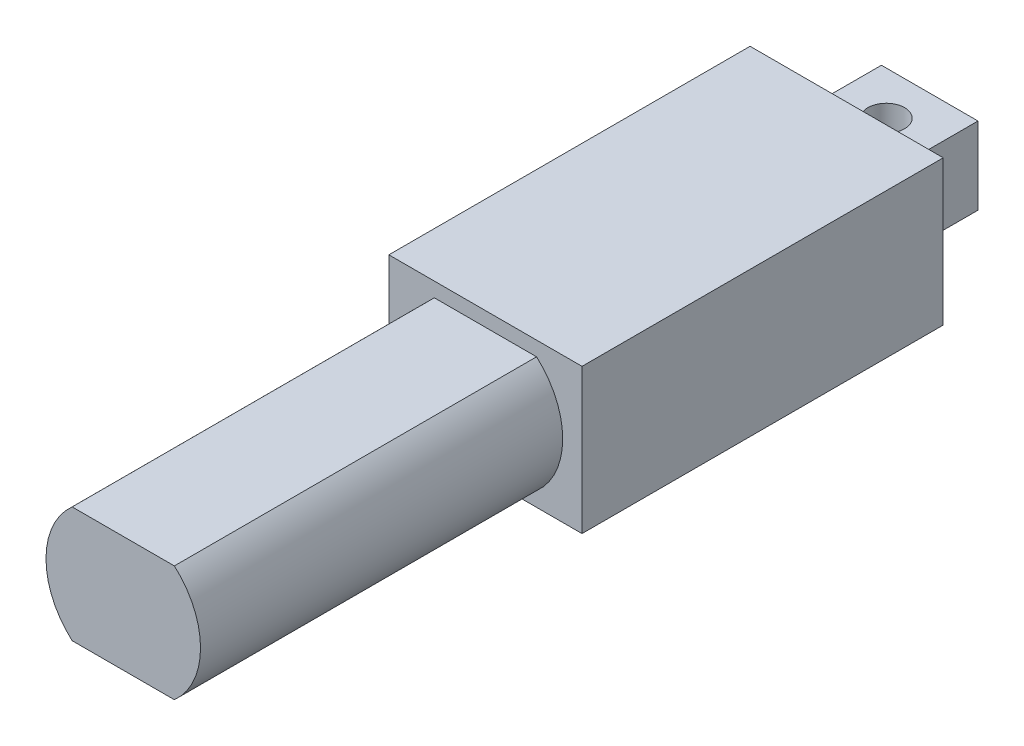
ISO-10303-21;
HEADER;
FILE_DESCRIPTION(('STEP AP214'),'2;1');
FILE_NAME('part.step','',(''),(''),'','','');
FILE_SCHEMA(('AUTOMOTIVE_DESIGN { 1 0 10303 214 1 1 1 1 }'));
ENDSEC;
DATA;
#1=APPLICATION_CONTEXT('core data for automotive mechanical design processes');
#2=APPLICATION_PROTOCOL_DEFINITION('international standard','automotive_design',2000,#1);
#3=PRODUCT_CONTEXT('',#1,'mechanical');
#4=PRODUCT('Part','Part','',(#3));
#5=PRODUCT_RELATED_PRODUCT_CATEGORY('part','',(#4));
#6=PRODUCT_DEFINITION_FORMATION('','',#4);
#7=PRODUCT_DEFINITION_CONTEXT('part definition',#1,'design');
#8=PRODUCT_DEFINITION('design','',#6,#7);
#9=PRODUCT_DEFINITION_SHAPE('','',#8);
#10=(LENGTH_UNIT() NAMED_UNIT(*) SI_UNIT(.MILLI.,.METRE.));
#11=(NAMED_UNIT(*) PLANE_ANGLE_UNIT() SI_UNIT($,.RADIAN.));
#12=(NAMED_UNIT(*) SI_UNIT($,.STERADIAN.) SOLID_ANGLE_UNIT());
#13=UNCERTAINTY_MEASURE_WITH_UNIT(LENGTH_MEASURE(1.E-05),#10,'distance_accuracy_value','');
#14=(GEOMETRIC_REPRESENTATION_CONTEXT(3) GLOBAL_UNCERTAINTY_ASSIGNED_CONTEXT((#13)) GLOBAL_UNIT_ASSIGNED_CONTEXT((#10,
#11,#12)) REPRESENTATION_CONTEXT('',''));
#15=CARTESIAN_POINT('',(0.,0.,0.));
#16=DIRECTION('',(0.,0.,1.));
#17=DIRECTION('',(1.,0.,0.));
#18=AXIS2_PLACEMENT_3D('',#15,#16,#17);
#19=CARTESIAN_POINT('',(0.,0.,46.));
#20=DIRECTION('',(0.,0.,1.));
#21=DIRECTION('',(1.,0.,0.));
#22=AXIS2_PLACEMENT_3D('',#19,#20,#21);
#23=PLANE('',#22);
#24=DIRECTION('',(-1.,0.,0.));
#25=VECTOR('',#24,1.);
#26=CARTESIAN_POINT('',(0.,-7.5,46.));
#27=LINE('',#26,#25);
#28=CARTESIAN_POINT('',(10.,-7.5,46.));
#29=VERTEX_POINT('',#28);
#30=CARTESIAN_POINT('',(-10.,-7.5,46.));
#31=VERTEX_POINT('',#30);
#32=EDGE_CURVE('E145',#29,#31,#27,.T.);
#33=ORIENTED_EDGE('',*,*,#32,.F.);
#34=DIRECTION('',(0.,1.,0.));
#35=VECTOR('',#34,1.);
#36=CARTESIAN_POINT('',(10.,0.,46.));
#37=LINE('',#36,#35);
#38=CARTESIAN_POINT('',(10.,7.5,46.));
#39=VERTEX_POINT('',#38);
#40=EDGE_CURVE('E148',#29,#39,#37,.T.);
#41=ORIENTED_EDGE('',*,*,#40,.T.);
#42=DIRECTION('',(-1.,0.,0.));
#43=VECTOR('',#42,1.);
#44=CARTESIAN_POINT('',(0.,7.5,46.));
#45=LINE('',#44,#43);
#46=CARTESIAN_POINT('',(-10.,7.5,46.));
#47=VERTEX_POINT('',#46);
#48=EDGE_CURVE('E151',#39,#47,#45,.T.);
#49=ORIENTED_EDGE('',*,*,#48,.T.);
#50=DIRECTION('',(0.,1.,0.));
#51=VECTOR('',#50,1.);
#52=CARTESIAN_POINT('',(-10.,0.,46.));
#53=LINE('',#52,#51);
#54=EDGE_CURVE('E153',#31,#47,#53,.T.);
#55=ORIENTED_EDGE('',*,*,#54,.F.);
#56=EDGE_LOOP('',(#33,#41,#49,#55));
#57=FACE_BOUND('',#56,.T.);
#58=CARTESIAN_POINT('',(0.,0.,46.));
#59=DIRECTION('',(0.,0.,1.));
#60=DIRECTION('',(1.,0.,0.));
#61=AXIS2_PLACEMENT_3D('',#58,#59,#60);
#62=CIRCLE('',#61,8.);
#63=CARTESIAN_POINT('',(-5.29150262212918,6.,46.));
#64=VERTEX_POINT('',#63);
#65=CARTESIAN_POINT('',(-5.29150262212918,-6.,46.));
#66=VERTEX_POINT('',#65);
#67=EDGE_CURVE('E137',#64,#66,#62,.T.);
#68=ORIENTED_EDGE('',*,*,#67,.F.);
#69=DIRECTION('',(1.,0.,0.));
#70=VECTOR('',#69,1.);
#71=CARTESIAN_POINT('',(0.,6.,46.));
#72=LINE('',#71,#70);
#73=CARTESIAN_POINT('',(5.29150262212918,6.,46.));
#74=VERTEX_POINT('',#73);
#75=EDGE_CURVE('E33',#64,#74,#72,.T.);
#76=ORIENTED_EDGE('',*,*,#75,.T.);
#77=CARTESIAN_POINT('',(0.,0.,46.));
#78=DIRECTION('',(0.,0.,1.));
#79=DIRECTION('',(1.,0.,0.));
#80=AXIS2_PLACEMENT_3D('',#77,#78,#79);
#81=CIRCLE('',#80,8.);
#82=CARTESIAN_POINT('',(5.29150262212918,-6.,46.));
#83=VERTEX_POINT('',#82);
#84=EDGE_CURVE('E38',#83,#74,#81,.T.);
#85=ORIENTED_EDGE('',*,*,#84,.F.);
#86=DIRECTION('',(1.,0.,0.));
#87=VECTOR('',#86,1.);
#88=CARTESIAN_POINT('',(0.,-6.,46.));
#89=LINE('',#88,#87);
#90=EDGE_CURVE('E128',#66,#83,#89,.T.);
#91=ORIENTED_EDGE('',*,*,#90,.F.);
#92=EDGE_LOOP('',(#68,#76,#85,#91));
#93=FACE_BOUND('',#92,.T.);
#94=ADVANCED_FACE('F17',(#57,#93),#23,.T.);
#95=CARTESIAN_POINT('',(0.,-4.,8.6));
#96=DIRECTION('',(0.,-1.,0.));
#97=DIRECTION('',(1.,0.,0.));
#98=AXIS2_PLACEMENT_3D('',#95,#96,#97);
#99=PLANE('',#98);
#100=CARTESIAN_POINT('',(0.,-4.,4.5));
#101=DIRECTION('',(0.,-1.,0.));
#102=DIRECTION('',(1.,0.,0.));
#103=AXIS2_PLACEMENT_3D('',#100,#101,#102);
#104=CIRCLE('',#103,1.9);
#105=CARTESIAN_POINT('',(1.9,-4.,4.5));
#106=VERTEX_POINT('',#105);
#107=EDGE_CURVE('E131',#106,#106,#104,.T.);
#108=ORIENTED_EDGE('',*,*,#107,.F.);
#109=EDGE_LOOP('',(#108));
#110=FACE_BOUND('',#109,.T.);
#111=DIRECTION('',(-1.,0.,0.));
#112=VECTOR('',#111,1.);
#113=CARTESIAN_POINT('',(0.,-4.,0.));
#114=LINE('',#113,#112);
#115=CARTESIAN_POINT('',(5.,-4.,0.));
#116=VERTEX_POINT('',#115);
#117=CARTESIAN_POINT('',(-5.,-4.,0.));
#118=VERTEX_POINT('',#117);
#119=EDGE_CURVE('E174',#116,#118,#114,.T.);
#120=ORIENTED_EDGE('',*,*,#119,.F.);
#121=DIRECTION('',(0.,0.,-1.));
#122=VECTOR('',#121,1.);
#123=CARTESIAN_POINT('',(5.,-4.,8.6));
#124=LINE('',#123,#122);
#125=CARTESIAN_POINT('',(5.,-4.,8.6));
#126=VERTEX_POINT('',#125);
#127=EDGE_CURVE('E11',#126,#116,#124,.T.);
#128=ORIENTED_EDGE('',*,*,#127,.F.);
#129=DIRECTION('',(-1.,0.,0.));
#130=VECTOR('',#129,1.);
#131=CARTESIAN_POINT('',(0.,-4.,8.6));
#132=LINE('',#131,#130);
#133=CARTESIAN_POINT('',(-5.,-4.,8.6));
#134=VERTEX_POINT('',#133);
#135=EDGE_CURVE('E175',#126,#134,#132,.T.);
#136=ORIENTED_EDGE('',*,*,#135,.T.);
#137=DIRECTION('',(0.,0.,-1.));
#138=VECTOR('',#137,1.);
#139=CARTESIAN_POINT('',(-5.,-4.,8.6));
#140=LINE('',#139,#138);
#141=EDGE_CURVE('E186',#134,#118,#140,.T.);
#142=ORIENTED_EDGE('',*,*,#141,.T.);
#143=EDGE_LOOP('',(#120,#128,#136,#142));
#144=FACE_BOUND('',#143,.T.);
#145=ADVANCED_FACE('F19',(#110,#144),#99,.T.);
#146=CARTESIAN_POINT('',(5.,0.,8.6));
#147=DIRECTION('',(-1.,0.,0.));
#148=DIRECTION('',(0.,0.,1.));
#149=AXIS2_PLACEMENT_3D('',#146,#147,#148);
#150=PLANE('',#149);
#151=DIRECTION('',(0.,1.,0.));
#152=VECTOR('',#151,1.);
#153=CARTESIAN_POINT('',(5.,0.,0.));
#154=LINE('',#153,#152);
#155=CARTESIAN_POINT('',(5.,4.,0.));
#156=VERTEX_POINT('',#155);
#157=EDGE_CURVE('E189',#116,#156,#154,.T.);
#158=ORIENTED_EDGE('',*,*,#157,.T.);
#159=DIRECTION('',(0.,0.,-1.));
#160=VECTOR('',#159,1.);
#161=CARTESIAN_POINT('',(5.,4.,8.6));
#162=LINE('',#161,#160);
#163=CARTESIAN_POINT('',(5.,4.,8.6));
#164=VERTEX_POINT('',#163);
#165=EDGE_CURVE('E26',#164,#156,#162,.T.);
#166=ORIENTED_EDGE('',*,*,#165,.F.);
#167=DIRECTION('',(0.,1.,0.));
#168=VECTOR('',#167,1.);
#169=CARTESIAN_POINT('',(5.,0.,8.6));
#170=LINE('',#169,#168);
#171=EDGE_CURVE('E178',#126,#164,#170,.T.);
#172=ORIENTED_EDGE('',*,*,#171,.F.);
#173=ORIENTED_EDGE('',*,*,#127,.T.);
#174=EDGE_LOOP('',(#158,#166,#172,#173));
#175=FACE_BOUND('',#174,.T.);
#176=ADVANCED_FACE('F220',(#175),#150,.F.);
#177=CARTESIAN_POINT('',(0.,4.,8.6));
#178=DIRECTION('',(0.,-1.,0.));
#179=DIRECTION('',(1.,0.,0.));
#180=AXIS2_PLACEMENT_3D('',#177,#178,#179);
#181=PLANE('',#180);
#182=CARTESIAN_POINT('',(0.,4.,4.5));
#183=DIRECTION('',(0.,-1.,0.));
#184=DIRECTION('',(1.,0.,0.));
#185=AXIS2_PLACEMENT_3D('',#182,#183,#184);
#186=CIRCLE('',#185,1.9);
#187=CARTESIAN_POINT('',(1.9,4.,4.5));
#188=VERTEX_POINT('',#187);
#189=EDGE_CURVE('E21',#188,#188,#186,.T.);
#190=ORIENTED_EDGE('',*,*,#189,.T.);
#191=EDGE_LOOP('',(#190));
#192=FACE_BOUND('',#191,.T.);
#193=DIRECTION('',(-1.,0.,0.));
#194=VECTOR('',#193,1.);
#195=CARTESIAN_POINT('',(0.,4.,0.));
#196=LINE('',#195,#194);
#197=CARTESIAN_POINT('',(-5.,4.,0.));
#198=VERTEX_POINT('',#197);
#199=EDGE_CURVE('E191',#156,#198,#196,.T.);
#200=ORIENTED_EDGE('',*,*,#199,.T.);
#201=DIRECTION('',(0.,0.,-1.));
#202=VECTOR('',#201,1.);
#203=CARTESIAN_POINT('',(-5.,4.,8.6));
#204=LINE('',#203,#202);
#205=CARTESIAN_POINT('',(-5.,4.,8.6));
#206=VERTEX_POINT('',#205);
#207=EDGE_CURVE('E197',#206,#198,#204,.T.);
#208=ORIENTED_EDGE('',*,*,#207,.F.);
#209=DIRECTION('',(-1.,0.,0.));
#210=VECTOR('',#209,1.);
#211=CARTESIAN_POINT('',(0.,4.,8.6));
#212=LINE('',#211,#210);
#213=EDGE_CURVE('E181',#164,#206,#212,.T.);
#214=ORIENTED_EDGE('',*,*,#213,.F.);
#215=ORIENTED_EDGE('',*,*,#165,.T.);
#216=EDGE_LOOP('',(#200,#208,#214,#215));
#217=FACE_BOUND('',#216,.T.);
#218=ADVANCED_FACE('F204',(#192,#217),#181,.F.);
#219=CARTESIAN_POINT('',(-5.,0.,8.6));
#220=DIRECTION('',(-1.,0.,0.));
#221=DIRECTION('',(0.,0.,1.));
#222=AXIS2_PLACEMENT_3D('',#219,#220,#221);
#223=PLANE('',#222);
#224=DIRECTION('',(0.,1.,0.));
#225=VECTOR('',#224,1.);
#226=CARTESIAN_POINT('',(-5.,0.,0.));
#227=LINE('',#226,#225);
#228=EDGE_CURVE('E179',#118,#198,#227,.T.);
#229=ORIENTED_EDGE('',*,*,#228,.F.);
#230=ORIENTED_EDGE('',*,*,#141,.F.);
#231=DIRECTION('',(0.,1.,0.));
#232=VECTOR('',#231,1.);
#233=CARTESIAN_POINT('',(-5.,0.,8.6));
#234=LINE('',#233,#232);
#235=EDGE_CURVE('E183',#134,#206,#234,.T.);
#236=ORIENTED_EDGE('',*,*,#235,.T.);
#237=ORIENTED_EDGE('',*,*,#207,.T.);
#238=EDGE_LOOP('',(#229,#230,#236,#237));
#239=FACE_BOUND('',#238,.T.);
#240=ADVANCED_FACE('F215',(#239),#223,.T.);
#241=CARTESIAN_POINT('',(0.,0.,0.));
#242=DIRECTION('',(0.,0.,1.));
#243=DIRECTION('',(1.,0.,0.));
#244=AXIS2_PLACEMENT_3D('',#241,#242,#243);
#245=PLANE('',#244);
#246=ORIENTED_EDGE('',*,*,#119,.T.);
#247=ORIENTED_EDGE('',*,*,#228,.T.);
#248=ORIENTED_EDGE('',*,*,#199,.F.);
#249=ORIENTED_EDGE('',*,*,#157,.F.);
#250=EDGE_LOOP('',(#246,#247,#248,#249));
#251=FACE_BOUND('',#250,.T.);
#252=ADVANCED_FACE('F210',(#251),#245,.F.);
#253=CARTESIAN_POINT('',(0.,-7.5,46.));
#254=DIRECTION('',(0.,-1.,0.));
#255=DIRECTION('',(1.,0.,0.));
#256=AXIS2_PLACEMENT_3D('',#253,#254,#255);
#257=PLANE('',#256);
#258=DIRECTION('',(-1.,0.,0.));
#259=VECTOR('',#258,1.);
#260=CARTESIAN_POINT('',(0.,-7.5,8.6));
#261=LINE('',#260,#259);
#262=CARTESIAN_POINT('',(10.,-7.5,8.6));
#263=VERTEX_POINT('',#262);
#264=CARTESIAN_POINT('',(-10.,-7.5,8.6));
#265=VERTEX_POINT('',#264);
#266=EDGE_CURVE('E112',#263,#265,#261,.T.);
#267=ORIENTED_EDGE('',*,*,#266,.F.);
#268=DIRECTION('',(0.,0.,-1.));
#269=VECTOR('',#268,1.);
#270=CARTESIAN_POINT('',(10.,-7.5,46.));
#271=LINE('',#270,#269);
#272=EDGE_CURVE('E172',#29,#263,#271,.T.);
#273=ORIENTED_EDGE('',*,*,#272,.F.);
#274=ORIENTED_EDGE('',*,*,#32,.T.);
#275=DIRECTION('',(0.,0.,-1.));
#276=VECTOR('',#275,1.);
#277=CARTESIAN_POINT('',(-10.,-7.5,46.));
#278=LINE('',#277,#276);
#279=EDGE_CURVE('E156',#31,#265,#278,.T.);
#280=ORIENTED_EDGE('',*,*,#279,.T.);
#281=EDGE_LOOP('',(#267,#273,#274,#280));
#282=FACE_BOUND('',#281,.T.);
#283=ADVANCED_FACE('F271',(#282),#257,.T.);
#284=CARTESIAN_POINT('',(10.,0.,46.));
#285=DIRECTION('',(-1.,0.,0.));
#286=DIRECTION('',(0.,0.,1.));
#287=AXIS2_PLACEMENT_3D('',#284,#285,#286);
#288=PLANE('',#287);
#289=DIRECTION('',(0.,1.,0.));
#290=VECTOR('',#289,1.);
#291=CARTESIAN_POINT('',(10.,0.,8.6));
#292=LINE('',#291,#290);
#293=CARTESIAN_POINT('',(10.,7.5,8.6));
#294=VERTEX_POINT('',#293);
#295=EDGE_CURVE('E159',#263,#294,#292,.T.);
#296=ORIENTED_EDGE('',*,*,#295,.T.);
#297=DIRECTION('',(0.,0.,-1.));
#298=VECTOR('',#297,1.);
#299=CARTESIAN_POINT('',(10.,7.5,46.));
#300=LINE('',#299,#298);
#301=EDGE_CURVE('E169',#39,#294,#300,.T.);
#302=ORIENTED_EDGE('',*,*,#301,.F.);
#303=ORIENTED_EDGE('',*,*,#40,.F.);
#304=ORIENTED_EDGE('',*,*,#272,.T.);
#305=EDGE_LOOP('',(#296,#302,#303,#304));
#306=FACE_BOUND('',#305,.T.);
#307=ADVANCED_FACE('F267',(#306),#288,.F.);
#308=CARTESIAN_POINT('',(0.,7.5,46.));
#309=DIRECTION('',(0.,-1.,0.));
#310=DIRECTION('',(0.,0.,-1.));
#311=AXIS2_PLACEMENT_3D('',#308,#309,#310);
#312=PLANE('',#311);
#313=DIRECTION('',(-1.,0.,0.));
#314=VECTOR('',#313,1.);
#315=CARTESIAN_POINT('',(0.,7.5,8.6));
#316=LINE('',#315,#314);
#317=CARTESIAN_POINT('',(-10.,7.5,8.6));
#318=VERTEX_POINT('',#317);
#319=EDGE_CURVE('E161',#294,#318,#316,.T.);
#320=ORIENTED_EDGE('',*,*,#319,.T.);
#321=DIRECTION('',(0.,0.,-1.));
#322=VECTOR('',#321,1.);
#323=CARTESIAN_POINT('',(-10.,7.5,46.));
#324=LINE('',#323,#322);
#325=EDGE_CURVE('E167',#47,#318,#324,.T.);
#326=ORIENTED_EDGE('',*,*,#325,.F.);
#327=ORIENTED_EDGE('',*,*,#48,.F.);
#328=ORIENTED_EDGE('',*,*,#301,.T.);
#329=EDGE_LOOP('',(#320,#326,#327,#328));
#330=FACE_BOUND('',#329,.T.);
#331=ADVANCED_FACE('F263',(#330),#312,.F.);
#332=CARTESIAN_POINT('',(-10.,0.,46.));
#333=DIRECTION('',(-1.,0.,0.));
#334=DIRECTION('',(0.,0.,1.));
#335=AXIS2_PLACEMENT_3D('',#332,#333,#334);
#336=PLANE('',#335);
#337=DIRECTION('',(0.,1.,0.));
#338=VECTOR('',#337,1.);
#339=CARTESIAN_POINT('',(-10.,0.,8.6));
#340=LINE('',#339,#338);
#341=EDGE_CURVE('E149',#265,#318,#340,.T.);
#342=ORIENTED_EDGE('',*,*,#341,.F.);
#343=ORIENTED_EDGE('',*,*,#279,.F.);
#344=ORIENTED_EDGE('',*,*,#54,.T.);
#345=ORIENTED_EDGE('',*,*,#325,.T.);
#346=EDGE_LOOP('',(#342,#343,#344,#345));
#347=FACE_BOUND('',#346,.T.);
#348=ADVANCED_FACE('F260',(#347),#336,.T.);
#349=CARTESIAN_POINT('',(0.,0.,8.6));
#350=DIRECTION('',(0.,0.,1.));
#351=DIRECTION('',(1.,0.,0.));
#352=AXIS2_PLACEMENT_3D('',#349,#350,#351);
#353=PLANE('',#352);
#354=ORIENTED_EDGE('',*,*,#135,.F.);
#355=ORIENTED_EDGE('',*,*,#171,.T.);
#356=ORIENTED_EDGE('',*,*,#213,.T.);
#357=ORIENTED_EDGE('',*,*,#235,.F.);
#358=EDGE_LOOP('',(#354,#355,#356,#357));
#359=FACE_BOUND('',#358,.T.);
#360=ORIENTED_EDGE('',*,*,#266,.T.);
#361=ORIENTED_EDGE('',*,*,#341,.T.);
#362=ORIENTED_EDGE('',*,*,#319,.F.);
#363=ORIENTED_EDGE('',*,*,#295,.F.);
#364=EDGE_LOOP('',(#360,#361,#362,#363));
#365=FACE_BOUND('',#364,.T.);
#366=ADVANCED_FACE('F217',(#359,#365),#353,.F.);
#367=CARTESIAN_POINT('',(0.,6.,83.5));
#368=DIRECTION('',(0.,1.,0.));
#369=DIRECTION('',(-1.,0.,0.));
#370=AXIS2_PLACEMENT_3D('',#367,#368,#369);
#371=PLANE('',#370);
#372=ORIENTED_EDGE('',*,*,#75,.F.);
#373=DIRECTION('',(0.,0.,-1.));
#374=VECTOR('',#373,1.);
#375=CARTESIAN_POINT('',(-5.29150262212918,6.,83.5));
#376=LINE('',#375,#374);
#377=CARTESIAN_POINT('',(-5.29150262212918,6.,83.5));
#378=VERTEX_POINT('',#377);
#379=EDGE_CURVE('E105',#378,#64,#376,.T.);
#380=ORIENTED_EDGE('',*,*,#379,.F.);
#381=DIRECTION('',(1.,0.,0.));
#382=VECTOR('',#381,1.);
#383=CARTESIAN_POINT('',(0.,6.,83.5));
#384=LINE('',#383,#382);
#385=CARTESIAN_POINT('',(5.29150262212918,6.,83.5));
#386=VERTEX_POINT('',#385);
#387=EDGE_CURVE('E109',#378,#386,#384,.T.);
#388=ORIENTED_EDGE('',*,*,#387,.T.);
#389=DIRECTION('',(0.,0.,-1.));
#390=VECTOR('',#389,1.);
#391=CARTESIAN_POINT('',(5.29150262212918,6.,83.5));
#392=LINE('',#391,#390);
#393=EDGE_CURVE('E135',#386,#74,#392,.T.);
#394=ORIENTED_EDGE('',*,*,#393,.T.);
#395=EDGE_LOOP('',(#372,#380,#388,#394));
#396=FACE_BOUND('',#395,.T.);
#397=ADVANCED_FACE('F107',(#396),#371,.T.);
#398=CARTESIAN_POINT('',(0.,0.,83.5));
#399=DIRECTION('',(0.,0.,-1.));
#400=DIRECTION('',(-1.,0.,0.));
#401=AXIS2_PLACEMENT_3D('',#398,#399,#400);
#402=CYLINDRICAL_SURFACE('',#401,8.);
#403=ORIENTED_EDGE('',*,*,#67,.T.);
#404=DIRECTION('',(0.,0.,-1.));
#405=VECTOR('',#404,1.);
#406=CARTESIAN_POINT('',(-5.29150262212918,-6.,83.5));
#407=LINE('',#406,#405);
#408=CARTESIAN_POINT('',(-5.29150262212918,-6.,83.5));
#409=VERTEX_POINT('',#408);
#410=EDGE_CURVE('E113',#409,#66,#407,.T.);
#411=ORIENTED_EDGE('',*,*,#410,.F.);
#412=CARTESIAN_POINT('',(0.,0.,83.5));
#413=DIRECTION('',(0.,0.,1.));
#414=DIRECTION('',(1.,0.,0.));
#415=AXIS2_PLACEMENT_3D('',#412,#413,#414);
#416=CIRCLE('',#415,8.);
#417=EDGE_CURVE('E116',#378,#409,#416,.T.);
#418=ORIENTED_EDGE('',*,*,#417,.F.);
#419=ORIENTED_EDGE('',*,*,#379,.T.);
#420=EDGE_LOOP('',(#403,#411,#418,#419));
#421=FACE_BOUND('',#420,.T.);
#422=ADVANCED_FACE('F117',(#421),#402,.T.);
#423=CARTESIAN_POINT('',(0.,-6.,83.5));
#424=DIRECTION('',(0.,1.,0.));
#425=DIRECTION('',(-1.,0.,0.));
#426=AXIS2_PLACEMENT_3D('',#423,#424,#425);
#427=PLANE('',#426);
#428=ORIENTED_EDGE('',*,*,#90,.T.);
#429=DIRECTION('',(0.,0.,-1.));
#430=VECTOR('',#429,1.);
#431=CARTESIAN_POINT('',(5.29150262212918,-6.,83.5));
#432=LINE('',#431,#430);
#433=CARTESIAN_POINT('',(5.29150262212918,-6.,83.5));
#434=VERTEX_POINT('',#433);
#435=EDGE_CURVE('E141',#434,#83,#432,.T.);
#436=ORIENTED_EDGE('',*,*,#435,.F.);
#437=DIRECTION('',(1.,0.,0.));
#438=VECTOR('',#437,1.);
#439=CARTESIAN_POINT('',(0.,-6.,83.5));
#440=LINE('',#439,#438);
#441=EDGE_CURVE('E121',#409,#434,#440,.T.);
#442=ORIENTED_EDGE('',*,*,#441,.F.);
#443=ORIENTED_EDGE('',*,*,#410,.T.);
#444=EDGE_LOOP('',(#428,#436,#442,#443));
#445=FACE_BOUND('',#444,.T.);
#446=ADVANCED_FACE('F249',(#445),#427,.F.);
#447=CARTESIAN_POINT('',(0.,0.,83.5));
#448=DIRECTION('',(0.,0.,-1.));
#449=DIRECTION('',(-1.,0.,0.));
#450=AXIS2_PLACEMENT_3D('',#447,#448,#449);
#451=CYLINDRICAL_SURFACE('',#450,8.);
#452=ORIENTED_EDGE('',*,*,#84,.T.);
#453=ORIENTED_EDGE('',*,*,#393,.F.);
#454=CARTESIAN_POINT('',(0.,0.,83.5));
#455=DIRECTION('',(0.,0.,1.));
#456=DIRECTION('',(1.,0.,0.));
#457=AXIS2_PLACEMENT_3D('',#454,#455,#456);
#458=CIRCLE('',#457,8.);
#459=EDGE_CURVE('E125',#434,#386,#458,.T.);
#460=ORIENTED_EDGE('',*,*,#459,.F.);
#461=ORIENTED_EDGE('',*,*,#435,.T.);
#462=EDGE_LOOP('',(#452,#453,#460,#461));
#463=FACE_BOUND('',#462,.T.);
#464=ADVANCED_FACE('F244',(#463),#451,.T.);
#465=CARTESIAN_POINT('',(0.,0.,83.5));
#466=DIRECTION('',(0.,0.,1.));
#467=DIRECTION('',(1.,0.,0.));
#468=AXIS2_PLACEMENT_3D('',#465,#466,#467);
#469=PLANE('',#468);
#470=ORIENTED_EDGE('',*,*,#387,.F.);
#471=ORIENTED_EDGE('',*,*,#417,.T.);
#472=ORIENTED_EDGE('',*,*,#441,.T.);
#473=ORIENTED_EDGE('',*,*,#459,.T.);
#474=EDGE_LOOP('',(#470,#471,#472,#473));
#475=FACE_BOUND('',#474,.T.);
#476=ADVANCED_FACE('F123',(#475),#469,.T.);
#477=CARTESIAN_POINT('',(0.,83.1722051120782,4.5));
#478=DIRECTION('',(0.,-1.,0.));
#479=DIRECTION('',(1.,0.,0.));
#480=AXIS2_PLACEMENT_3D('',#477,#478,#479);
#481=CYLINDRICAL_SURFACE('',#480,1.9);
#482=ORIENTED_EDGE('',*,*,#107,.T.);
#483=EDGE_LOOP('',(#482));
#484=FACE_BOUND('',#483,.T.);
#485=ORIENTED_EDGE('',*,*,#189,.F.);
#486=EDGE_LOOP('',(#485));
#487=FACE_BOUND('',#486,.T.);
#488=ADVANCED_FACE('F238',(#484,#487),#481,.F.);
#489=CLOSED_SHELL('',(#94,#145,#176,#218,#240,#252,#283,#307,#331,#348,#366,#397,#422,#446,#464,
#476,#488));
#490=MANIFOLD_SOLID_BREP('B1',#489);
#491=ADVANCED_BREP_SHAPE_REPRESENTATION('',(#18,#490),#14);
#492=SHAPE_DEFINITION_REPRESENTATION(#9,#491);
ENDSEC;
END-ISO-10303-21;
